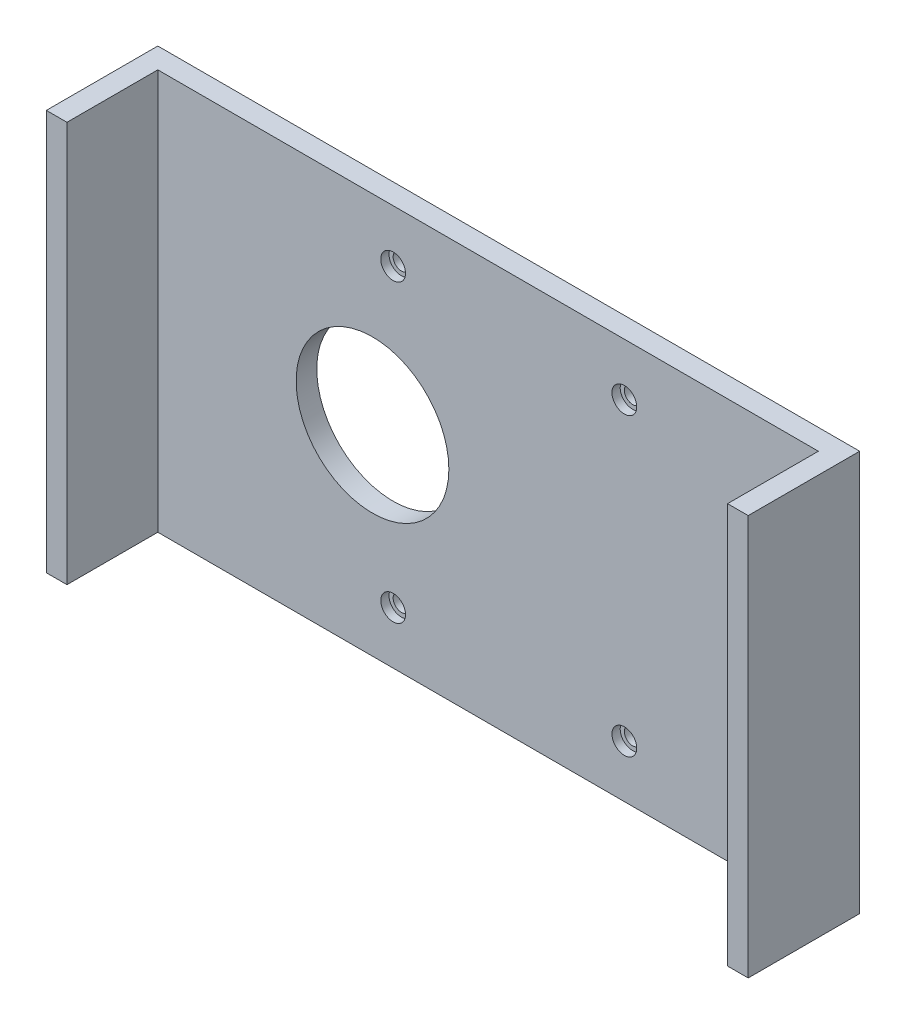
ISO-10303-21;
HEADER;
FILE_DESCRIPTION(('STEP AP214'),'2;1');
FILE_NAME('part.step','',(''),(''),'','','');
FILE_SCHEMA(('AUTOMOTIVE_DESIGN { 1 0 10303 214 1 1 1 1 }'));
ENDSEC;
DATA;
#1=APPLICATION_CONTEXT('core data for automotive mechanical design processes');
#2=APPLICATION_PROTOCOL_DEFINITION('international standard','automotive_design',2000,#1);
#3=PRODUCT_CONTEXT('',#1,'mechanical');
#4=PRODUCT('Part','Part','',(#3));
#5=PRODUCT_RELATED_PRODUCT_CATEGORY('part','',(#4));
#6=PRODUCT_DEFINITION_FORMATION('','',#4);
#7=PRODUCT_DEFINITION_CONTEXT('part definition',#1,'design');
#8=PRODUCT_DEFINITION('design','',#6,#7);
#9=PRODUCT_DEFINITION_SHAPE('','',#8);
#10=(LENGTH_UNIT() NAMED_UNIT(*) SI_UNIT(.MILLI.,.METRE.));
#11=(NAMED_UNIT(*) PLANE_ANGLE_UNIT() SI_UNIT($,.RADIAN.));
#12=(NAMED_UNIT(*) SI_UNIT($,.STERADIAN.) SOLID_ANGLE_UNIT());
#13=UNCERTAINTY_MEASURE_WITH_UNIT(LENGTH_MEASURE(1.E-05),#10,'distance_accuracy_value','');
#14=(GEOMETRIC_REPRESENTATION_CONTEXT(3) GLOBAL_UNCERTAINTY_ASSIGNED_CONTEXT((#13)) GLOBAL_UNIT_ASSIGNED_CONTEXT((#10,
#11,#12)) REPRESENTATION_CONTEXT('',''));
#15=CARTESIAN_POINT('',(0.,0.,0.));
#16=DIRECTION('',(0.,0.,1.));
#17=DIRECTION('',(1.,0.,0.));
#18=AXIS2_PLACEMENT_3D('',#15,#16,#17);
#19=CARTESIAN_POINT('',(-108.,-12.7,0.));
#20=DIRECTION('',(0.,0.,1.));
#21=DIRECTION('',(1.,0.,0.));
#22=AXIS2_PLACEMENT_3D('',#19,#20,#21);
#23=CYLINDRICAL_SURFACE('',#22,2.);
#24=CARTESIAN_POINT('',(-108.,-12.7,0.));
#25=DIRECTION('',(0.,0.,1.));
#26=DIRECTION('',(1.,0.,0.));
#27=AXIS2_PLACEMENT_3D('',#24,#25,#26);
#28=CIRCLE('',#27,2.);
#29=CARTESIAN_POINT('',(-106.,-12.7,0.));
#30=VERTEX_POINT('',#29);
#31=EDGE_CURVE('E226',#30,#30,#28,.T.);
#32=ORIENTED_EDGE('',*,*,#31,.F.);
#33=EDGE_LOOP('',(#32));
#34=FACE_BOUND('',#33,.T.);
#35=CARTESIAN_POINT('',(-108.,-12.7,3.));
#36=DIRECTION('',(0.,0.,1.));
#37=DIRECTION('',(1.,0.,0.));
#38=AXIS2_PLACEMENT_3D('',#35,#36,#37);
#39=CIRCLE('',#38,2.);
#40=CARTESIAN_POINT('',(-106.,-12.7,3.));
#41=VERTEX_POINT('',#40);
#42=EDGE_CURVE('E47',#41,#41,#39,.F.);
#43=ORIENTED_EDGE('',*,*,#42,.F.);
#44=EDGE_LOOP('',(#43));
#45=FACE_BOUND('',#44,.T.);
#46=ADVANCED_FACE('F43',(#34,#45),#23,.F.);
#47=CARTESIAN_POINT('',(-108.,-84.3,0.));
#48=DIRECTION('',(0.,0.,1.));
#49=DIRECTION('',(1.,0.,0.));
#50=AXIS2_PLACEMENT_3D('',#47,#48,#49);
#51=CYLINDRICAL_SURFACE('',#50,2.);
#52=CARTESIAN_POINT('',(-108.,-84.3,0.));
#53=DIRECTION('',(0.,0.,1.));
#54=DIRECTION('',(1.,0.,0.));
#55=AXIS2_PLACEMENT_3D('',#52,#53,#54);
#56=CIRCLE('',#55,2.);
#57=CARTESIAN_POINT('',(-106.,-84.3,0.));
#58=VERTEX_POINT('',#57);
#59=EDGE_CURVE('E215',#58,#58,#56,.T.);
#60=ORIENTED_EDGE('',*,*,#59,.F.);
#61=EDGE_LOOP('',(#60));
#62=FACE_BOUND('',#61,.T.);
#63=CARTESIAN_POINT('',(-108.,-84.3,3.));
#64=DIRECTION('',(0.,0.,1.));
#65=DIRECTION('',(1.,0.,0.));
#66=AXIS2_PLACEMENT_3D('',#63,#64,#65);
#67=CIRCLE('',#66,2.);
#68=CARTESIAN_POINT('',(-106.,-84.3,3.));
#69=VERTEX_POINT('',#68);
#70=EDGE_CURVE('E197',#69,#69,#67,.F.);
#71=ORIENTED_EDGE('',*,*,#70,.F.);
#72=EDGE_LOOP('',(#71));
#73=FACE_BOUND('',#72,.T.);
#74=ADVANCED_FACE('F265',(#62,#73),#51,.F.);
#75=CARTESIAN_POINT('',(-52.,-12.7,0.));
#76=DIRECTION('',(0.,0.,1.));
#77=DIRECTION('',(1.,0.,0.));
#78=AXIS2_PLACEMENT_3D('',#75,#76,#77);
#79=CYLINDRICAL_SURFACE('',#78,2.);
#80=CARTESIAN_POINT('',(-52.,-12.7,0.));
#81=DIRECTION('',(0.,0.,1.));
#82=DIRECTION('',(1.,0.,0.));
#83=AXIS2_PLACEMENT_3D('',#80,#81,#82);
#84=CIRCLE('',#83,2.);
#85=CARTESIAN_POINT('',(-50.,-12.7,0.));
#86=VERTEX_POINT('',#85);
#87=EDGE_CURVE('E209',#86,#86,#84,.T.);
#88=ORIENTED_EDGE('',*,*,#87,.F.);
#89=EDGE_LOOP('',(#88));
#90=FACE_BOUND('',#89,.T.);
#91=CARTESIAN_POINT('',(-52.,-12.7,3.));
#92=DIRECTION('',(0.,0.,1.));
#93=DIRECTION('',(1.,0.,0.));
#94=AXIS2_PLACEMENT_3D('',#91,#92,#93);
#95=CIRCLE('',#94,2.);
#96=CARTESIAN_POINT('',(-50.,-12.7,3.));
#97=VERTEX_POINT('',#96);
#98=EDGE_CURVE('E193',#97,#97,#95,.F.);
#99=ORIENTED_EDGE('',*,*,#98,.F.);
#100=EDGE_LOOP('',(#99));
#101=FACE_BOUND('',#100,.T.);
#102=ADVANCED_FACE('F271',(#90,#101),#79,.F.);
#103=CARTESIAN_POINT('',(-52.,-84.3,0.));
#104=DIRECTION('',(0.,0.,1.));
#105=DIRECTION('',(1.,0.,0.));
#106=AXIS2_PLACEMENT_3D('',#103,#104,#105);
#107=CYLINDRICAL_SURFACE('',#106,2.);
#108=CARTESIAN_POINT('',(-52.,-84.3,0.));
#109=DIRECTION('',(0.,0.,1.));
#110=DIRECTION('',(1.,0.,0.));
#111=AXIS2_PLACEMENT_3D('',#108,#109,#110);
#112=CIRCLE('',#111,2.);
#113=CARTESIAN_POINT('',(-50.,-84.3,0.));
#114=VERTEX_POINT('',#113);
#115=EDGE_CURVE('E204',#114,#114,#112,.T.);
#116=ORIENTED_EDGE('',*,*,#115,.F.);
#117=EDGE_LOOP('',(#116));
#118=FACE_BOUND('',#117,.T.);
#119=CARTESIAN_POINT('',(-52.,-84.3,3.));
#120=DIRECTION('',(0.,0.,1.));
#121=DIRECTION('',(1.,0.,0.));
#122=AXIS2_PLACEMENT_3D('',#119,#120,#121);
#123=CIRCLE('',#122,2.);
#124=CARTESIAN_POINT('',(-50.,-84.3,3.));
#125=VERTEX_POINT('',#124);
#126=EDGE_CURVE('E189',#125,#125,#123,.F.);
#127=ORIENTED_EDGE('',*,*,#126,.F.);
#128=EDGE_LOOP('',(#127));
#129=FACE_BOUND('',#128,.T.);
#130=ADVANCED_FACE('F282',(#118,#129),#107,.F.);
#131=CARTESIAN_POINT('',(-170.,-97.,27.));
#132=DIRECTION('',(0.,1.,0.));
#133=DIRECTION('',(-1.,0.,0.));
#134=AXIS2_PLACEMENT_3D('',#131,#132,#133);
#135=PLANE('',#134);
#136=DIRECTION('',(1.,0.,0.));
#137=VECTOR('',#136,1.);
#138=CARTESIAN_POINT('',(-170.,-97.,27.));
#139=LINE('',#138,#137);
#140=CARTESIAN_POINT('',(-5.,-97.,27.));
#141=VERTEX_POINT('',#140);
#142=CARTESIAN_POINT('',(0.,-97.,27.));
#143=VERTEX_POINT('',#142);
#144=EDGE_CURVE('E138',#141,#143,#139,.T.);
#145=ORIENTED_EDGE('',*,*,#144,.F.);
#146=DIRECTION('',(0.,0.,1.));
#147=VECTOR('',#146,1.);
#148=CARTESIAN_POINT('',(-5.,-97.,0.));
#149=LINE('',#148,#147);
#150=CARTESIAN_POINT('',(-5.,-97.,5.));
#151=VERTEX_POINT('',#150);
#152=EDGE_CURVE('E124',#151,#141,#149,.T.);
#153=ORIENTED_EDGE('',*,*,#152,.F.);
#154=DIRECTION('',(1.,0.,0.));
#155=VECTOR('',#154,1.);
#156=CARTESIAN_POINT('',(0.,-97.,5.));
#157=LINE('',#156,#155);
#158=CARTESIAN_POINT('',(-165.,-97.,5.));
#159=VERTEX_POINT('',#158);
#160=EDGE_CURVE('E134',#159,#151,#157,.T.);
#161=ORIENTED_EDGE('',*,*,#160,.F.);
#162=DIRECTION('',(0.,0.,1.));
#163=VECTOR('',#162,1.);
#164=CARTESIAN_POINT('',(-165.,-97.,0.));
#165=LINE('',#164,#163);
#166=CARTESIAN_POINT('',(-165.,-97.,27.));
#167=VERTEX_POINT('',#166);
#168=EDGE_CURVE('E232',#159,#167,#165,.T.);
#169=ORIENTED_EDGE('',*,*,#168,.T.);
#170=CARTESIAN_POINT('',(-170.,-97.,27.));
#171=VERTEX_POINT('',#170);
#172=EDGE_CURVE('E96',#171,#167,#139,.T.);
#173=ORIENTED_EDGE('',*,*,#172,.F.);
#174=DIRECTION('',(0.,0.,-1.));
#175=VECTOR('',#174,1.);
#176=CARTESIAN_POINT('',(-170.,-97.,27.));
#177=LINE('',#176,#175);
#178=CARTESIAN_POINT('',(-170.,-97.,0.));
#179=VERTEX_POINT('',#178);
#180=EDGE_CURVE('E181',#171,#179,#177,.T.);
#181=ORIENTED_EDGE('',*,*,#180,.T.);
#182=DIRECTION('',(1.,0.,0.));
#183=VECTOR('',#182,1.);
#184=CARTESIAN_POINT('',(-170.,-97.,0.));
#185=LINE('',#184,#183);
#186=CARTESIAN_POINT('',(0.,-97.,0.));
#187=VERTEX_POINT('',#186);
#188=EDGE_CURVE('E166',#179,#187,#185,.T.);
#189=ORIENTED_EDGE('',*,*,#188,.T.);
#190=DIRECTION('',(0.,0.,-1.));
#191=VECTOR('',#190,1.);
#192=CARTESIAN_POINT('',(0.,-97.,27.));
#193=LINE('',#192,#191);
#194=EDGE_CURVE('E146',#143,#187,#193,.T.);
#195=ORIENTED_EDGE('',*,*,#194,.F.);
#196=EDGE_LOOP('',(#145,#153,#161,#169,#173,#181,#189,#195));
#197=FACE_BOUND('',#196,.T.);
#198=ADVANCED_FACE('F145',(#197),#135,.F.);
#199=CARTESIAN_POINT('',(-170.,0.,27.));
#200=DIRECTION('',(0.,-1.,0.));
#201=DIRECTION('',(0.,0.,-1.));
#202=AXIS2_PLACEMENT_3D('',#199,#200,#201);
#203=PLANE('',#202);
#204=DIRECTION('',(0.,0.,-1.));
#205=VECTOR('',#204,1.);
#206=CARTESIAN_POINT('',(-5.,0.,27.));
#207=LINE('',#206,#205);
#208=CARTESIAN_POINT('',(-5.,0.,27.));
#209=VERTEX_POINT('',#208);
#210=CARTESIAN_POINT('',(-5.,0.,5.));
#211=VERTEX_POINT('',#210);
#212=EDGE_CURVE('E184',#209,#211,#207,.T.);
#213=ORIENTED_EDGE('',*,*,#212,.F.);
#214=DIRECTION('',(-1.,0.,0.));
#215=VECTOR('',#214,1.);
#216=CARTESIAN_POINT('',(-170.,0.,27.));
#217=LINE('',#216,#215);
#218=CARTESIAN_POINT('',(0.,0.,27.));
#219=VERTEX_POINT('',#218);
#220=EDGE_CURVE('E141',#219,#209,#217,.T.);
#221=ORIENTED_EDGE('',*,*,#220,.F.);
#222=DIRECTION('',(0.,0.,-1.));
#223=VECTOR('',#222,1.);
#224=CARTESIAN_POINT('',(0.,0.,27.));
#225=LINE('',#224,#223);
#226=CARTESIAN_POINT('',(0.,0.,0.));
#227=VERTEX_POINT('',#226);
#228=EDGE_CURVE('E176',#219,#227,#225,.T.);
#229=ORIENTED_EDGE('',*,*,#228,.T.);
#230=DIRECTION('',(-1.,0.,0.));
#231=VECTOR('',#230,1.);
#232=CARTESIAN_POINT('',(-170.,0.,0.));
#233=LINE('',#232,#231);
#234=CARTESIAN_POINT('',(-170.,0.,0.));
#235=VERTEX_POINT('',#234);
#236=EDGE_CURVE('E88',#227,#235,#233,.T.);
#237=ORIENTED_EDGE('',*,*,#236,.T.);
#238=DIRECTION('',(0.,0.,-1.));
#239=VECTOR('',#238,1.);
#240=CARTESIAN_POINT('',(-170.,0.,27.));
#241=LINE('',#240,#239);
#242=CARTESIAN_POINT('',(-170.,0.,27.));
#243=VERTEX_POINT('',#242);
#244=EDGE_CURVE('E161',#243,#235,#241,.T.);
#245=ORIENTED_EDGE('',*,*,#244,.F.);
#246=CARTESIAN_POINT('',(-165.,0.,27.));
#247=VERTEX_POINT('',#246);
#248=EDGE_CURVE('E63',#247,#243,#217,.T.);
#249=ORIENTED_EDGE('',*,*,#248,.F.);
#250=DIRECTION('',(0.,0.,-1.));
#251=VECTOR('',#250,1.);
#252=CARTESIAN_POINT('',(-165.,0.,27.));
#253=LINE('',#252,#251);
#254=CARTESIAN_POINT('',(-165.,0.,5.));
#255=VERTEX_POINT('',#254);
#256=EDGE_CURVE('E11',#247,#255,#253,.T.);
#257=ORIENTED_EDGE('',*,*,#256,.T.);
#258=DIRECTION('',(-1.,0.,0.));
#259=VECTOR('',#258,1.);
#260=CARTESIAN_POINT('',(-170.,0.,5.));
#261=LINE('',#260,#259);
#262=EDGE_CURVE('E54',#211,#255,#261,.T.);
#263=ORIENTED_EDGE('',*,*,#262,.F.);
#264=EDGE_LOOP('',(#213,#221,#229,#237,#245,#249,#257,#263));
#265=FACE_BOUND('',#264,.T.);
#266=ADVANCED_FACE('F241',(#265),#203,.F.);
#267=CARTESIAN_POINT('',(0.,0.,27.));
#268=DIRECTION('',(0.,0.,1.));
#269=DIRECTION('',(1.,0.,0.));
#270=AXIS2_PLACEMENT_3D('',#267,#268,#269);
#271=PLANE('',#270);
#272=ORIENTED_EDGE('',*,*,#220,.T.);
#273=DIRECTION('',(0.,1.,0.));
#274=VECTOR('',#273,1.);
#275=CARTESIAN_POINT('',(-5.,-97.,27.));
#276=LINE('',#275,#274);
#277=EDGE_CURVE('E127',#141,#209,#276,.T.);
#278=ORIENTED_EDGE('',*,*,#277,.F.);
#279=ORIENTED_EDGE('',*,*,#144,.T.);
#280=DIRECTION('',(0.,1.,0.));
#281=VECTOR('',#280,1.);
#282=CARTESIAN_POINT('',(0.,0.,27.));
#283=LINE('',#282,#281);
#284=EDGE_CURVE('E153',#143,#219,#283,.T.);
#285=ORIENTED_EDGE('',*,*,#284,.T.);
#286=EDGE_LOOP('',(#272,#278,#279,#285));
#287=FACE_BOUND('',#286,.T.);
#288=ADVANCED_FACE('F137',(#287),#271,.T.);
#289=CARTESIAN_POINT('',(-170.,0.,27.));
#290=DIRECTION('',(1.,0.,0.));
#291=DIRECTION('',(0.,1.,0.));
#292=AXIS2_PLACEMENT_3D('',#289,#290,#291);
#293=PLANE('',#292);
#294=DIRECTION('',(0.,-1.,0.));
#295=VECTOR('',#294,1.);
#296=CARTESIAN_POINT('',(-170.,0.,0.));
#297=LINE('',#296,#295);
#298=EDGE_CURVE('E162',#235,#179,#297,.T.);
#299=ORIENTED_EDGE('',*,*,#298,.T.);
#300=ORIENTED_EDGE('',*,*,#180,.F.);
#301=DIRECTION('',(0.,-1.,0.));
#302=VECTOR('',#301,1.);
#303=CARTESIAN_POINT('',(-170.,0.,27.));
#304=LINE('',#303,#302);
#305=EDGE_CURVE('E149',#243,#171,#304,.T.);
#306=ORIENTED_EDGE('',*,*,#305,.F.);
#307=ORIENTED_EDGE('',*,*,#244,.T.);
#308=EDGE_LOOP('',(#299,#300,#306,#307));
#309=FACE_BOUND('',#308,.T.);
#310=ADVANCED_FACE('F45',(#309),#293,.F.);
#311=CARTESIAN_POINT('',(0.,0.,27.));
#312=DIRECTION('',(-1.,0.,0.));
#313=DIRECTION('',(0.,-1.,0.));
#314=AXIS2_PLACEMENT_3D('',#311,#312,#313);
#315=PLANE('',#314);
#316=DIRECTION('',(0.,1.,0.));
#317=VECTOR('',#316,1.);
#318=CARTESIAN_POINT('',(0.,0.,0.));
#319=LINE('',#318,#317);
#320=EDGE_CURVE('E82',#187,#227,#319,.T.);
#321=ORIENTED_EDGE('',*,*,#320,.T.);
#322=ORIENTED_EDGE('',*,*,#228,.F.);
#323=ORIENTED_EDGE('',*,*,#284,.F.);
#324=ORIENTED_EDGE('',*,*,#194,.T.);
#325=EDGE_LOOP('',(#321,#322,#323,#324));
#326=FACE_BOUND('',#325,.T.);
#327=ADVANCED_FACE('F252',(#326),#315,.F.);
#328=DIRECTION('',(0.,1.,0.));
#329=VECTOR('',#328,1.);
#330=CARTESIAN_POINT('',(-165.,-97.,27.));
#331=LINE('',#330,#329);
#332=EDGE_CURVE('E143',#167,#247,#331,.T.);
#333=ORIENTED_EDGE('',*,*,#332,.T.);
#334=ORIENTED_EDGE('',*,*,#248,.T.);
#335=ORIENTED_EDGE('',*,*,#305,.T.);
#336=ORIENTED_EDGE('',*,*,#172,.T.);
#337=EDGE_LOOP('',(#333,#334,#335,#336));
#338=FACE_BOUND('',#337,.T.);
#339=ADVANCED_FACE('F246',(#338),#271,.T.);
#340=CARTESIAN_POINT('',(0.,0.,0.));
#341=DIRECTION('',(0.,0.,1.));
#342=DIRECTION('',(1.,0.,0.));
#343=AXIS2_PLACEMENT_3D('',#340,#341,#342);
#344=PLANE('',#343);
#345=ORIENTED_EDGE('',*,*,#115,.T.);
#346=EDGE_LOOP('',(#345));
#347=FACE_BOUND('',#346,.T.);
#348=ORIENTED_EDGE('',*,*,#87,.T.);
#349=EDGE_LOOP('',(#348));
#350=FACE_BOUND('',#349,.T.);
#351=ORIENTED_EDGE('',*,*,#59,.T.);
#352=EDGE_LOOP('',(#351));
#353=FACE_BOUND('',#352,.T.);
#354=ORIENTED_EDGE('',*,*,#31,.T.);
#355=EDGE_LOOP('',(#354));
#356=FACE_BOUND('',#355,.T.);
#357=CARTESIAN_POINT('',(-113.,-48.5,0.));
#358=DIRECTION('',(0.,0.,1.));
#359=DIRECTION('',(1.,0.,0.));
#360=AXIS2_PLACEMENT_3D('',#357,#358,#359);
#361=CIRCLE('',#360,18.5);
#362=CARTESIAN_POINT('',(-94.5,-48.5,0.));
#363=VERTEX_POINT('',#362);
#364=EDGE_CURVE('E219',#363,#363,#361,.T.);
#365=ORIENTED_EDGE('',*,*,#364,.T.);
#366=EDGE_LOOP('',(#365));
#367=FACE_BOUND('',#366,.T.);
#368=ORIENTED_EDGE('',*,*,#298,.F.);
#369=ORIENTED_EDGE('',*,*,#236,.F.);
#370=ORIENTED_EDGE('',*,*,#320,.F.);
#371=ORIENTED_EDGE('',*,*,#188,.F.);
#372=EDGE_LOOP('',(#368,#369,#370,#371));
#373=FACE_BOUND('',#372,.T.);
#374=ADVANCED_FACE('F253',(#347,#350,#353,#356,#367,#373),#344,.F.);
#375=CARTESIAN_POINT('',(-165.,-97.,0.));
#376=DIRECTION('',(-1.,0.,0.));
#377=DIRECTION('',(0.,0.,1.));
#378=AXIS2_PLACEMENT_3D('',#375,#376,#377);
#379=PLANE('',#378);
#380=ORIENTED_EDGE('',*,*,#256,.F.);
#381=ORIENTED_EDGE('',*,*,#332,.F.);
#382=ORIENTED_EDGE('',*,*,#168,.F.);
#383=DIRECTION('',(0.,1.,0.));
#384=VECTOR('',#383,1.);
#385=CARTESIAN_POINT('',(-165.,-97.,5.));
#386=LINE('',#385,#384);
#387=EDGE_CURVE('E167',#159,#255,#386,.T.);
#388=ORIENTED_EDGE('',*,*,#387,.T.);
#389=EDGE_LOOP('',(#380,#381,#382,#388));
#390=FACE_BOUND('',#389,.T.);
#391=ADVANCED_FACE('F244',(#390),#379,.F.);
#392=CARTESIAN_POINT('',(0.,-97.,5.));
#393=DIRECTION('',(0.,0.,1.));
#394=DIRECTION('',(1.,0.,0.));
#395=AXIS2_PLACEMENT_3D('',#392,#393,#394);
#396=PLANE('',#395);
#397=CARTESIAN_POINT('',(-52.,-12.7,5.));
#398=DIRECTION('',(0.,0.,1.));
#399=DIRECTION('',(1.,0.,0.));
#400=AXIS2_PLACEMENT_3D('',#397,#398,#399);
#401=CIRCLE('',#400,3.);
#402=CARTESIAN_POINT('',(-49.,-12.7,5.));
#403=VERTEX_POINT('',#402);
#404=EDGE_CURVE('E490',#403,#403,#401,.T.);
#405=ORIENTED_EDGE('',*,*,#404,.F.);
#406=EDGE_LOOP('',(#405));
#407=FACE_BOUND('',#406,.T.);
#408=CARTESIAN_POINT('',(-108.,-84.3,5.));
#409=DIRECTION('',(0.,0.,1.));
#410=DIRECTION('',(1.,0.,0.));
#411=AXIS2_PLACEMENT_3D('',#408,#409,#410);
#412=CIRCLE('',#411,3.00000000000001);
#413=CARTESIAN_POINT('',(-105.,-84.3,5.));
#414=VERTEX_POINT('',#413);
#415=EDGE_CURVE('E507',#414,#414,#412,.T.);
#416=ORIENTED_EDGE('',*,*,#415,.F.);
#417=EDGE_LOOP('',(#416));
#418=FACE_BOUND('',#417,.T.);
#419=CARTESIAN_POINT('',(-52.,-84.3,5.));
#420=DIRECTION('',(0.,0.,1.));
#421=DIRECTION('',(1.,0.,0.));
#422=AXIS2_PLACEMENT_3D('',#419,#420,#421);
#423=CIRCLE('',#422,3.);
#424=CARTESIAN_POINT('',(-49.,-84.3,5.));
#425=VERTEX_POINT('',#424);
#426=EDGE_CURVE('E519',#425,#425,#423,.T.);
#427=ORIENTED_EDGE('',*,*,#426,.F.);
#428=EDGE_LOOP('',(#427));
#429=FACE_BOUND('',#428,.T.);
#430=CARTESIAN_POINT('',(-108.,-12.7,5.));
#431=DIRECTION('',(0.,0.,1.));
#432=DIRECTION('',(1.,0.,0.));
#433=AXIS2_PLACEMENT_3D('',#430,#431,#432);
#434=CIRCLE('',#433,3.00000000000001);
#435=CARTESIAN_POINT('',(-105.,-12.7,5.));
#436=VERTEX_POINT('',#435);
#437=EDGE_CURVE('E481',#436,#436,#434,.T.);
#438=ORIENTED_EDGE('',*,*,#437,.F.);
#439=EDGE_LOOP('',(#438));
#440=FACE_BOUND('',#439,.T.);
#441=CARTESIAN_POINT('',(-113.,-48.5,5.));
#442=DIRECTION('',(0.,0.,1.));
#443=DIRECTION('',(1.,0.,0.));
#444=AXIS2_PLACEMENT_3D('',#441,#442,#443);
#445=CIRCLE('',#444,18.5);
#446=CARTESIAN_POINT('',(-94.5,-48.5,5.));
#447=VERTEX_POINT('',#446);
#448=EDGE_CURVE('E223',#447,#447,#445,.T.);
#449=ORIENTED_EDGE('',*,*,#448,.F.);
#450=EDGE_LOOP('',(#449));
#451=FACE_BOUND('',#450,.T.);
#452=ORIENTED_EDGE('',*,*,#262,.T.);
#453=ORIENTED_EDGE('',*,*,#387,.F.);
#454=ORIENTED_EDGE('',*,*,#160,.T.);
#455=DIRECTION('',(0.,1.,0.));
#456=VECTOR('',#455,1.);
#457=CARTESIAN_POINT('',(-5.,-97.,5.));
#458=LINE('',#457,#456);
#459=EDGE_CURVE('E130',#151,#211,#458,.T.);
#460=ORIENTED_EDGE('',*,*,#459,.T.);
#461=EDGE_LOOP('',(#452,#453,#454,#460));
#462=FACE_BOUND('',#461,.T.);
#463=ADVANCED_FACE('F240',(#407,#418,#429,#440,#451,#462),#396,.T.);
#464=CARTESIAN_POINT('',(-5.,-97.,0.));
#465=DIRECTION('',(-1.,0.,0.));
#466=DIRECTION('',(0.,0.,1.));
#467=AXIS2_PLACEMENT_3D('',#464,#465,#466);
#468=PLANE('',#467);
#469=ORIENTED_EDGE('',*,*,#212,.T.);
#470=ORIENTED_EDGE('',*,*,#459,.F.);
#471=ORIENTED_EDGE('',*,*,#152,.T.);
#472=ORIENTED_EDGE('',*,*,#277,.T.);
#473=EDGE_LOOP('',(#469,#470,#471,#472));
#474=FACE_BOUND('',#473,.T.);
#475=ADVANCED_FACE('F126',(#474),#468,.T.);
#476=CARTESIAN_POINT('',(-113.,-48.5,0.));
#477=DIRECTION('',(0.,0.,1.));
#478=DIRECTION('',(1.,0.,0.));
#479=AXIS2_PLACEMENT_3D('',#476,#477,#478);
#480=CYLINDRICAL_SURFACE('',#479,18.5);
#481=ORIENTED_EDGE('',*,*,#364,.F.);
#482=EDGE_LOOP('',(#481));
#483=FACE_BOUND('',#482,.T.);
#484=ORIENTED_EDGE('',*,*,#448,.T.);
#485=EDGE_LOOP('',(#484));
#486=FACE_BOUND('',#485,.T.);
#487=ADVANCED_FACE('F287',(#483,#486),#480,.F.);
#488=CARTESIAN_POINT('',(-52.,-84.3,3.));
#489=DIRECTION('',(0.,0.,1.));
#490=DIRECTION('',(1.,0.,0.));
#491=AXIS2_PLACEMENT_3D('',#488,#489,#490);
#492=PLANE('',#491);
#493=CARTESIAN_POINT('',(-52.,-84.3,3.));
#494=DIRECTION('',(0.,0.,1.));
#495=DIRECTION('',(1.,0.,0.));
#496=AXIS2_PLACEMENT_3D('',#493,#494,#495);
#497=CIRCLE('',#496,3.);
#498=CARTESIAN_POINT('',(-49.,-84.3,3.));
#499=VERTEX_POINT('',#498);
#500=EDGE_CURVE('E512',#499,#499,#497,.T.);
#501=ORIENTED_EDGE('',*,*,#500,.T.);
#502=EDGE_LOOP('',(#501));
#503=FACE_BOUND('',#502,.T.);
#504=ORIENTED_EDGE('',*,*,#126,.T.);
#505=EDGE_LOOP('',(#504));
#506=FACE_BOUND('',#505,.T.);
#507=ADVANCED_FACE('F289',(#503,#506),#492,.T.);
#508=CARTESIAN_POINT('',(-52.,-84.3,3.));
#509=DIRECTION('',(0.,0.,1.));
#510=DIRECTION('',(1.,0.,0.));
#511=AXIS2_PLACEMENT_3D('',#508,#509,#510);
#512=CYLINDRICAL_SURFACE('',#511,3.);
#513=ORIENTED_EDGE('',*,*,#500,.F.);
#514=EDGE_LOOP('',(#513));
#515=FACE_BOUND('',#514,.T.);
#516=ORIENTED_EDGE('',*,*,#426,.T.);
#517=EDGE_LOOP('',(#516));
#518=FACE_BOUND('',#517,.T.);
#519=ADVANCED_FACE('F311',(#515,#518),#512,.F.);
#520=CARTESIAN_POINT('',(-52.,-12.7,3.));
#521=DIRECTION('',(0.,0.,1.));
#522=DIRECTION('',(1.,0.,0.));
#523=AXIS2_PLACEMENT_3D('',#520,#521,#522);
#524=PLANE('',#523);
#525=CARTESIAN_POINT('',(-52.,-12.7,3.));
#526=DIRECTION('',(0.,0.,1.));
#527=DIRECTION('',(1.,0.,0.));
#528=AXIS2_PLACEMENT_3D('',#525,#526,#527);
#529=CIRCLE('',#528,3.);
#530=CARTESIAN_POINT('',(-49.,-12.7,3.));
#531=VERTEX_POINT('',#530);
#532=EDGE_CURVE('E484',#531,#531,#529,.T.);
#533=ORIENTED_EDGE('',*,*,#532,.T.);
#534=EDGE_LOOP('',(#533));
#535=FACE_BOUND('',#534,.T.);
#536=ORIENTED_EDGE('',*,*,#98,.T.);
#537=EDGE_LOOP('',(#536));
#538=FACE_BOUND('',#537,.T.);
#539=ADVANCED_FACE('F319',(#535,#538),#524,.T.);
#540=CARTESIAN_POINT('',(-52.,-12.7,3.));
#541=DIRECTION('',(0.,0.,1.));
#542=DIRECTION('',(1.,0.,0.));
#543=AXIS2_PLACEMENT_3D('',#540,#541,#542);
#544=CYLINDRICAL_SURFACE('',#543,3.);
#545=ORIENTED_EDGE('',*,*,#532,.F.);
#546=EDGE_LOOP('',(#545));
#547=FACE_BOUND('',#546,.T.);
#548=ORIENTED_EDGE('',*,*,#404,.T.);
#549=EDGE_LOOP('',(#548));
#550=FACE_BOUND('',#549,.T.);
#551=ADVANCED_FACE('F327',(#547,#550),#544,.F.);
#552=CARTESIAN_POINT('',(-108.,-84.3,3.));
#553=DIRECTION('',(0.,0.,1.));
#554=DIRECTION('',(1.,0.,0.));
#555=AXIS2_PLACEMENT_3D('',#552,#553,#554);
#556=PLANE('',#555);
#557=CARTESIAN_POINT('',(-108.,-84.3,3.));
#558=DIRECTION('',(0.,0.,1.));
#559=DIRECTION('',(1.,0.,0.));
#560=AXIS2_PLACEMENT_3D('',#557,#558,#559);
#561=CIRCLE('',#560,3.00000000000001);
#562=CARTESIAN_POINT('',(-105.,-84.3,3.));
#563=VERTEX_POINT('',#562);
#564=EDGE_CURVE('E511',#563,#563,#561,.T.);
#565=ORIENTED_EDGE('',*,*,#564,.T.);
#566=EDGE_LOOP('',(#565));
#567=FACE_BOUND('',#566,.T.);
#568=ORIENTED_EDGE('',*,*,#70,.T.);
#569=EDGE_LOOP('',(#568));
#570=FACE_BOUND('',#569,.T.);
#571=ADVANCED_FACE('F335',(#567,#570),#556,.T.);
#572=CARTESIAN_POINT('',(-108.,-84.3,3.));
#573=DIRECTION('',(0.,0.,1.));
#574=DIRECTION('',(1.,0.,0.));
#575=AXIS2_PLACEMENT_3D('',#572,#573,#574);
#576=CYLINDRICAL_SURFACE('',#575,3.00000000000001);
#577=ORIENTED_EDGE('',*,*,#564,.F.);
#578=EDGE_LOOP('',(#577));
#579=FACE_BOUND('',#578,.T.);
#580=ORIENTED_EDGE('',*,*,#415,.T.);
#581=EDGE_LOOP('',(#580));
#582=FACE_BOUND('',#581,.T.);
#583=ADVANCED_FACE('F343',(#579,#582),#576,.F.);
#584=CARTESIAN_POINT('',(-108.,-12.7,3.));
#585=DIRECTION('',(0.,0.,1.));
#586=DIRECTION('',(1.,0.,0.));
#587=AXIS2_PLACEMENT_3D('',#584,#585,#586);
#588=PLANE('',#587);
#589=CARTESIAN_POINT('',(-108.,-12.7,3.));
#590=DIRECTION('',(0.,0.,1.));
#591=DIRECTION('',(1.,0.,0.));
#592=AXIS2_PLACEMENT_3D('',#589,#590,#591);
#593=CIRCLE('',#592,3.00000000000001);
#594=CARTESIAN_POINT('',(-105.,-12.7,3.));
#595=VERTEX_POINT('',#594);
#596=EDGE_CURVE('E194',#595,#595,#593,.T.);
#597=ORIENTED_EDGE('',*,*,#596,.T.);
#598=EDGE_LOOP('',(#597));
#599=FACE_BOUND('',#598,.T.);
#600=ORIENTED_EDGE('',*,*,#42,.T.);
#601=EDGE_LOOP('',(#600));
#602=FACE_BOUND('',#601,.T.);
#603=ADVANCED_FACE('F351',(#599,#602),#588,.T.);
#604=CARTESIAN_POINT('',(-108.,-12.7,3.));
#605=DIRECTION('',(0.,0.,1.));
#606=DIRECTION('',(1.,0.,0.));
#607=AXIS2_PLACEMENT_3D('',#604,#605,#606);
#608=CYLINDRICAL_SURFACE('',#607,3.00000000000001);
#609=ORIENTED_EDGE('',*,*,#596,.F.);
#610=EDGE_LOOP('',(#609));
#611=FACE_BOUND('',#610,.T.);
#612=ORIENTED_EDGE('',*,*,#437,.T.);
#613=EDGE_LOOP('',(#612));
#614=FACE_BOUND('',#613,.T.);
#615=ADVANCED_FACE('F277',(#611,#614),#608,.F.);
#616=CLOSED_SHELL('',(#46,#74,#102,#130,#198,#266,#288,#310,#327,#339,#374,#391,#463,#475,#487,
#507,#519,#539,#551,#571,#583,#603,#615));
#617=MANIFOLD_SOLID_BREP('B2',#616);
#618=ADVANCED_BREP_SHAPE_REPRESENTATION('',(#18,#617),#14);
#619=SHAPE_DEFINITION_REPRESENTATION(#9,#618);
ENDSEC;
END-ISO-10303-21;
